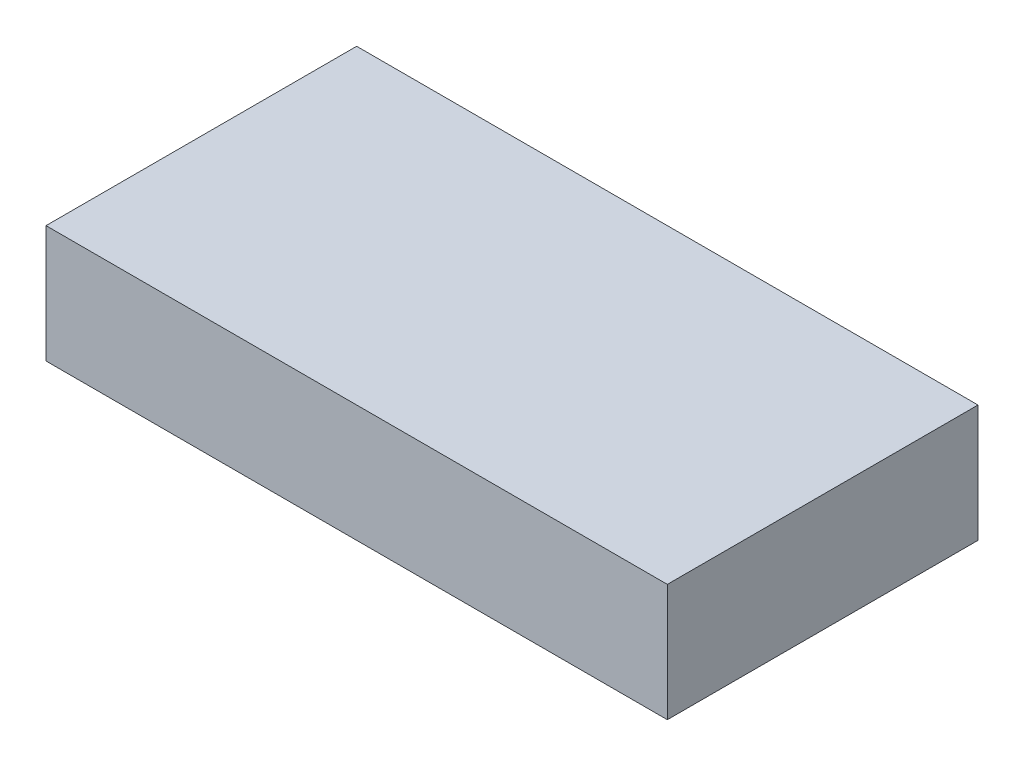
ISO-10303-21;
HEADER;
FILE_DESCRIPTION(('STEP AP214'),'2;1');
FILE_NAME('part.step','',(''),(''),'','','');
FILE_SCHEMA(('AUTOMOTIVE_DESIGN { 1 0 10303 214 1 1 1 1 }'));
ENDSEC;
DATA;
#1=APPLICATION_CONTEXT('core data for automotive mechanical design processes');
#2=APPLICATION_PROTOCOL_DEFINITION('international standard','automotive_design',2000,#1);
#3=PRODUCT_CONTEXT('',#1,'mechanical');
#4=PRODUCT('Part','Part','',(#3));
#5=PRODUCT_RELATED_PRODUCT_CATEGORY('part','',(#4));
#6=PRODUCT_DEFINITION_FORMATION('','',#4);
#7=PRODUCT_DEFINITION_CONTEXT('part definition',#1,'design');
#8=PRODUCT_DEFINITION('design','',#6,#7);
#9=PRODUCT_DEFINITION_SHAPE('','',#8);
#10=(LENGTH_UNIT() NAMED_UNIT(*) SI_UNIT(.MILLI.,.METRE.));
#11=(NAMED_UNIT(*) PLANE_ANGLE_UNIT() SI_UNIT($,.RADIAN.));
#12=(NAMED_UNIT(*) SI_UNIT($,.STERADIAN.) SOLID_ANGLE_UNIT());
#13=UNCERTAINTY_MEASURE_WITH_UNIT(LENGTH_MEASURE(1.E-05),#10,'distance_accuracy_value','');
#14=(GEOMETRIC_REPRESENTATION_CONTEXT(3) GLOBAL_UNCERTAINTY_ASSIGNED_CONTEXT((#13)) GLOBAL_UNIT_ASSIGNED_CONTEXT((#10,
#11,#12)) REPRESENTATION_CONTEXT('',''));
#15=CARTESIAN_POINT('',(0.,0.,0.));
#16=DIRECTION('',(0.,0.,1.));
#17=DIRECTION('',(1.,0.,0.));
#18=AXIS2_PLACEMENT_3D('',#15,#16,#17);
#19=CARTESIAN_POINT('',(0.,3.,0.));
#20=DIRECTION('',(1.,0.,0.));
#21=DIRECTION('',(0.,0.,-1.));
#22=AXIS2_PLACEMENT_3D('',#19,#20,#21);
#23=PLANE('',#22);
#24=DIRECTION('',(0.,0.,1.));
#25=VECTOR('',#24,1.);
#26=CARTESIAN_POINT('',(0.,0.,0.));
#27=LINE('',#26,#25);
#28=CARTESIAN_POINT('',(0.,0.,0.));
#29=VERTEX_POINT('',#28);
#30=CARTESIAN_POINT('',(0.,0.,7.95));
#31=VERTEX_POINT('',#30);
#32=EDGE_CURVE('E140',#29,#31,#27,.T.);
#33=ORIENTED_EDGE('',*,*,#32,.T.);
#34=DIRECTION('',(0.,-1.,0.));
#35=VECTOR('',#34,1.);
#36=CARTESIAN_POINT('',(0.,3.,7.95));
#37=LINE('',#36,#35);
#38=CARTESIAN_POINT('',(0.,3.,7.95));
#39=VERTEX_POINT('',#38);
#40=EDGE_CURVE('E11',#39,#31,#37,.T.);
#41=ORIENTED_EDGE('',*,*,#40,.F.);
#42=DIRECTION('',(0.,0.,1.));
#43=VECTOR('',#42,1.);
#44=CARTESIAN_POINT('',(0.,3.,0.));
#45=LINE('',#44,#43);
#46=CARTESIAN_POINT('',(0.,3.,0.));
#47=VERTEX_POINT('',#46);
#48=EDGE_CURVE('E144',#47,#39,#45,.T.);
#49=ORIENTED_EDGE('',*,*,#48,.F.);
#50=DIRECTION('',(0.,-1.,0.));
#51=VECTOR('',#50,1.);
#52=CARTESIAN_POINT('',(0.,3.,0.));
#53=LINE('',#52,#51);
#54=EDGE_CURVE('E150',#47,#29,#53,.T.);
#55=ORIENTED_EDGE('',*,*,#54,.T.);
#56=EDGE_LOOP('',(#33,#41,#49,#55));
#57=FACE_BOUND('',#56,.T.);
#58=ADVANCED_FACE('F32',(#57),#23,.F.);
#59=CARTESIAN_POINT('',(0.,3.,7.95));
#60=DIRECTION('',(0.,0.,-1.));
#61=DIRECTION('',(-1.,0.,0.));
#62=AXIS2_PLACEMENT_3D('',#59,#60,#61);
#63=PLANE('',#62);
#64=DIRECTION('',(1.,0.,0.));
#65=VECTOR('',#64,1.);
#66=CARTESIAN_POINT('',(0.,0.,7.95));
#67=LINE('',#66,#65);
#68=CARTESIAN_POINT('',(15.9,0.,7.95));
#69=VERTEX_POINT('',#68);
#70=EDGE_CURVE('E153',#31,#69,#67,.T.);
#71=ORIENTED_EDGE('',*,*,#70,.T.);
#72=DIRECTION('',(0.,-1.,0.));
#73=VECTOR('',#72,1.);
#74=CARTESIAN_POINT('',(15.9,3.,7.95));
#75=LINE('',#74,#73);
#76=CARTESIAN_POINT('',(15.9,3.,7.95));
#77=VERTEX_POINT('',#76);
#78=EDGE_CURVE('E39',#77,#69,#75,.T.);
#79=ORIENTED_EDGE('',*,*,#78,.F.);
#80=DIRECTION('',(1.,0.,0.));
#81=VECTOR('',#80,1.);
#82=CARTESIAN_POINT('',(0.,3.,7.95));
#83=LINE('',#82,#81);
#84=EDGE_CURVE('E83',#39,#77,#83,.T.);
#85=ORIENTED_EDGE('',*,*,#84,.F.);
#86=ORIENTED_EDGE('',*,*,#40,.T.);
#87=EDGE_LOOP('',(#71,#79,#85,#86));
#88=FACE_BOUND('',#87,.T.);
#89=ADVANCED_FACE('F181',(#88),#63,.F.);
#90=CARTESIAN_POINT('',(15.9,3.,0.));
#91=DIRECTION('',(-1.,0.,0.));
#92=DIRECTION('',(0.,0.,1.));
#93=AXIS2_PLACEMENT_3D('',#90,#91,#92);
#94=PLANE('',#93);
#95=DIRECTION('',(0.,0.,-1.));
#96=VECTOR('',#95,1.);
#97=CARTESIAN_POINT('',(15.9,0.,0.));
#98=LINE('',#97,#96);
#99=CARTESIAN_POINT('',(15.9,0.,0.));
#100=VERTEX_POINT('',#99);
#101=EDGE_CURVE('E155',#69,#100,#98,.T.);
#102=ORIENTED_EDGE('',*,*,#101,.T.);
#103=DIRECTION('',(0.,-1.,0.));
#104=VECTOR('',#103,1.);
#105=CARTESIAN_POINT('',(15.9,3.,0.));
#106=LINE('',#105,#104);
#107=CARTESIAN_POINT('',(15.9,3.,0.));
#108=VERTEX_POINT('',#107);
#109=EDGE_CURVE('E159',#108,#100,#106,.T.);
#110=ORIENTED_EDGE('',*,*,#109,.F.);
#111=DIRECTION('',(0.,0.,-1.));
#112=VECTOR('',#111,1.);
#113=CARTESIAN_POINT('',(15.9,3.,0.));
#114=LINE('',#113,#112);
#115=EDGE_CURVE('E147',#77,#108,#114,.T.);
#116=ORIENTED_EDGE('',*,*,#115,.F.);
#117=ORIENTED_EDGE('',*,*,#78,.T.);
#118=EDGE_LOOP('',(#102,#110,#116,#117));
#119=FACE_BOUND('',#118,.T.);
#120=ADVANCED_FACE('F164',(#119),#94,.F.);
#121=CARTESIAN_POINT('',(0.,3.,0.));
#122=DIRECTION('',(0.,0.,1.));
#123=DIRECTION('',(1.,0.,0.));
#124=AXIS2_PLACEMENT_3D('',#121,#122,#123);
#125=PLANE('',#124);
#126=DIRECTION('',(-1.,0.,0.));
#127=VECTOR('',#126,1.);
#128=CARTESIAN_POINT('',(0.,0.,0.));
#129=LINE('',#128,#127);
#130=EDGE_CURVE('E76',#100,#29,#129,.T.);
#131=ORIENTED_EDGE('',*,*,#130,.T.);
#132=ORIENTED_EDGE('',*,*,#54,.F.);
#133=DIRECTION('',(-1.,0.,0.));
#134=VECTOR('',#133,1.);
#135=CARTESIAN_POINT('',(0.,3.,0.));
#136=LINE('',#135,#134);
#137=EDGE_CURVE('E55',#108,#47,#136,.T.);
#138=ORIENTED_EDGE('',*,*,#137,.F.);
#139=ORIENTED_EDGE('',*,*,#109,.T.);
#140=EDGE_LOOP('',(#131,#132,#138,#139));
#141=FACE_BOUND('',#140,.T.);
#142=ADVANCED_FACE('F172',(#141),#125,.F.);
#143=CARTESIAN_POINT('',(0.,3.,7.95));
#144=DIRECTION('',(0.,1.,0.));
#145=DIRECTION('',(0.,0.,1.));
#146=AXIS2_PLACEMENT_3D('',#143,#144,#145);
#147=PLANE('',#146);
#148=ORIENTED_EDGE('',*,*,#48,.T.);
#149=ORIENTED_EDGE('',*,*,#84,.T.);
#150=ORIENTED_EDGE('',*,*,#115,.T.);
#151=ORIENTED_EDGE('',*,*,#137,.T.);
#152=EDGE_LOOP('',(#148,#149,#150,#151));
#153=FACE_BOUND('',#152,.T.);
#154=ADVANCED_FACE('F174',(#153),#147,.T.);
#155=CARTESIAN_POINT('',(0.,0.,7.95));
#156=DIRECTION('',(0.,1.,0.));
#157=DIRECTION('',(0.,0.,1.));
#158=AXIS2_PLACEMENT_3D('',#155,#156,#157);
#159=PLANE('',#158);
#160=DIRECTION('',(-1.,0.,0.));
#161=VECTOR('',#160,1.);
#162=CARTESIAN_POINT('',(1.5,0.,6.45));
#163=LINE('',#162,#161);
#164=CARTESIAN_POINT('',(14.4,0.,6.45));
#165=VERTEX_POINT('',#164);
#166=CARTESIAN_POINT('',(1.5,0.,6.45));
#167=VERTEX_POINT('',#166);
#168=EDGE_CURVE('E134',#165,#167,#163,.T.);
#169=ORIENTED_EDGE('',*,*,#168,.F.);
#170=DIRECTION('',(0.,0.,1.));
#171=VECTOR('',#170,1.);
#172=CARTESIAN_POINT('',(14.4,0.,6.45));
#173=LINE('',#172,#171);
#174=CARTESIAN_POINT('',(14.4,0.,1.5));
#175=VERTEX_POINT('',#174);
#176=EDGE_CURVE('E46',#175,#165,#173,.T.);
#177=ORIENTED_EDGE('',*,*,#176,.F.);
#178=DIRECTION('',(1.,0.,0.));
#179=VECTOR('',#178,1.);
#180=CARTESIAN_POINT('',(1.5,0.,1.5));
#181=LINE('',#180,#179);
#182=CARTESIAN_POINT('',(1.5,0.,1.5));
#183=VERTEX_POINT('',#182);
#184=EDGE_CURVE('E125',#183,#175,#181,.T.);
#185=ORIENTED_EDGE('',*,*,#184,.F.);
#186=DIRECTION('',(0.,0.,-1.));
#187=VECTOR('',#186,1.);
#188=CARTESIAN_POINT('',(1.5,0.,6.45));
#189=LINE('',#188,#187);
#190=EDGE_CURVE('E128',#167,#183,#189,.T.);
#191=ORIENTED_EDGE('',*,*,#190,.F.);
#192=EDGE_LOOP('',(#169,#177,#185,#191));
#193=FACE_BOUND('',#192,.T.);
#194=ORIENTED_EDGE('',*,*,#32,.F.);
#195=ORIENTED_EDGE('',*,*,#130,.F.);
#196=ORIENTED_EDGE('',*,*,#101,.F.);
#197=ORIENTED_EDGE('',*,*,#70,.F.);
#198=EDGE_LOOP('',(#194,#195,#196,#197));
#199=FACE_BOUND('',#198,.T.);
#200=ADVANCED_FACE('F168',(#193,#199),#159,.F.);
#201=CARTESIAN_POINT('',(14.4,2.,6.45));
#202=DIRECTION('',(1.,0.,0.));
#203=DIRECTION('',(0.,0.,-1.));
#204=AXIS2_PLACEMENT_3D('',#201,#202,#203);
#205=PLANE('',#204);
#206=ORIENTED_EDGE('',*,*,#176,.T.);
#207=DIRECTION('',(0.,-1.,0.));
#208=VECTOR('',#207,1.);
#209=CARTESIAN_POINT('',(14.4,2.,6.45));
#210=LINE('',#209,#208);
#211=CARTESIAN_POINT('',(14.4,2.,6.45));
#212=VERTEX_POINT('',#211);
#213=EDGE_CURVE('E103',#212,#165,#210,.T.);
#214=ORIENTED_EDGE('',*,*,#213,.F.);
#215=DIRECTION('',(0.,0.,1.));
#216=VECTOR('',#215,1.);
#217=CARTESIAN_POINT('',(14.4,2.,6.45));
#218=LINE('',#217,#216);
#219=CARTESIAN_POINT('',(14.4,2.,1.5));
#220=VERTEX_POINT('',#219);
#221=EDGE_CURVE('E107',#220,#212,#218,.T.);
#222=ORIENTED_EDGE('',*,*,#221,.F.);
#223=DIRECTION('',(0.,-1.,0.));
#224=VECTOR('',#223,1.);
#225=CARTESIAN_POINT('',(14.4,2.,1.5));
#226=LINE('',#225,#224);
#227=EDGE_CURVE('E138',#220,#175,#226,.T.);
#228=ORIENTED_EDGE('',*,*,#227,.T.);
#229=EDGE_LOOP('',(#206,#214,#222,#228));
#230=FACE_BOUND('',#229,.T.);
#231=ADVANCED_FACE('F105',(#230),#205,.F.);
#232=CARTESIAN_POINT('',(1.5,2.,1.5));
#233=DIRECTION('',(0.,0.,-1.));
#234=DIRECTION('',(-1.,0.,0.));
#235=AXIS2_PLACEMENT_3D('',#232,#233,#234);
#236=PLANE('',#235);
#237=ORIENTED_EDGE('',*,*,#184,.T.);
#238=ORIENTED_EDGE('',*,*,#227,.F.);
#239=DIRECTION('',(1.,0.,0.));
#240=VECTOR('',#239,1.);
#241=CARTESIAN_POINT('',(1.5,2.,1.5));
#242=LINE('',#241,#240);
#243=CARTESIAN_POINT('',(1.5,2.,1.5));
#244=VERTEX_POINT('',#243);
#245=EDGE_CURVE('E113',#244,#220,#242,.T.);
#246=ORIENTED_EDGE('',*,*,#245,.F.);
#247=DIRECTION('',(0.,-1.,0.));
#248=VECTOR('',#247,1.);
#249=CARTESIAN_POINT('',(1.5,2.,1.5));
#250=LINE('',#249,#248);
#251=EDGE_CURVE('E141',#244,#183,#250,.T.);
#252=ORIENTED_EDGE('',*,*,#251,.T.);
#253=EDGE_LOOP('',(#237,#238,#246,#252));
#254=FACE_BOUND('',#253,.T.);
#255=ADVANCED_FACE('F221',(#254),#236,.F.);
#256=CARTESIAN_POINT('',(1.5,2.,6.45));
#257=DIRECTION('',(-1.,0.,0.));
#258=DIRECTION('',(0.,0.,1.));
#259=AXIS2_PLACEMENT_3D('',#256,#257,#258);
#260=PLANE('',#259);
#261=ORIENTED_EDGE('',*,*,#190,.T.);
#262=ORIENTED_EDGE('',*,*,#251,.F.);
#263=DIRECTION('',(0.,0.,-1.));
#264=VECTOR('',#263,1.);
#265=CARTESIAN_POINT('',(1.5,2.,6.45));
#266=LINE('',#265,#264);
#267=CARTESIAN_POINT('',(1.5,2.,6.45));
#268=VERTEX_POINT('',#267);
#269=EDGE_CURVE('E121',#268,#244,#266,.T.);
#270=ORIENTED_EDGE('',*,*,#269,.F.);
#271=DIRECTION('',(0.,-1.,0.));
#272=VECTOR('',#271,1.);
#273=CARTESIAN_POINT('',(1.5,2.,6.45));
#274=LINE('',#273,#272);
#275=EDGE_CURVE('E112',#268,#167,#274,.T.);
#276=ORIENTED_EDGE('',*,*,#275,.T.);
#277=EDGE_LOOP('',(#261,#262,#270,#276));
#278=FACE_BOUND('',#277,.T.);
#279=ADVANCED_FACE('F230',(#278),#260,.F.);
#280=CARTESIAN_POINT('',(1.5,2.,6.45));
#281=DIRECTION('',(0.,0.,1.));
#282=DIRECTION('',(1.,0.,0.));
#283=AXIS2_PLACEMENT_3D('',#280,#281,#282);
#284=PLANE('',#283);
#285=ORIENTED_EDGE('',*,*,#168,.T.);
#286=ORIENTED_EDGE('',*,*,#275,.F.);
#287=DIRECTION('',(-1.,0.,0.));
#288=VECTOR('',#287,1.);
#289=CARTESIAN_POINT('',(1.5,2.,6.45));
#290=LINE('',#289,#288);
#291=EDGE_CURVE('E116',#212,#268,#290,.T.);
#292=ORIENTED_EDGE('',*,*,#291,.F.);
#293=ORIENTED_EDGE('',*,*,#213,.T.);
#294=EDGE_LOOP('',(#285,#286,#292,#293));
#295=FACE_BOUND('',#294,.T.);
#296=ADVANCED_FACE('F117',(#295),#284,.F.);
#297=CARTESIAN_POINT('',(14.4,2.,1.5));
#298=DIRECTION('',(0.,-1.,0.));
#299=DIRECTION('',(0.,0.,-1.));
#300=AXIS2_PLACEMENT_3D('',#297,#298,#299);
#301=PLANE('',#300);
#302=ORIENTED_EDGE('',*,*,#221,.T.);
#303=ORIENTED_EDGE('',*,*,#291,.T.);
#304=ORIENTED_EDGE('',*,*,#269,.T.);
#305=ORIENTED_EDGE('',*,*,#245,.T.);
#306=EDGE_LOOP('',(#302,#303,#304,#305));
#307=FACE_BOUND('',#306,.T.);
#308=ADVANCED_FACE('F123',(#307),#301,.T.);
#309=CLOSED_SHELL('',(#58,#89,#120,#142,#154,#200,#231,#255,#279,#296,#308));
#310=MANIFOLD_SOLID_BREP('B2',#309);
#311=ADVANCED_BREP_SHAPE_REPRESENTATION('',(#18,#310),#14);
#312=SHAPE_DEFINITION_REPRESENTATION(#9,#311);
ENDSEC;
END-ISO-10303-21;
